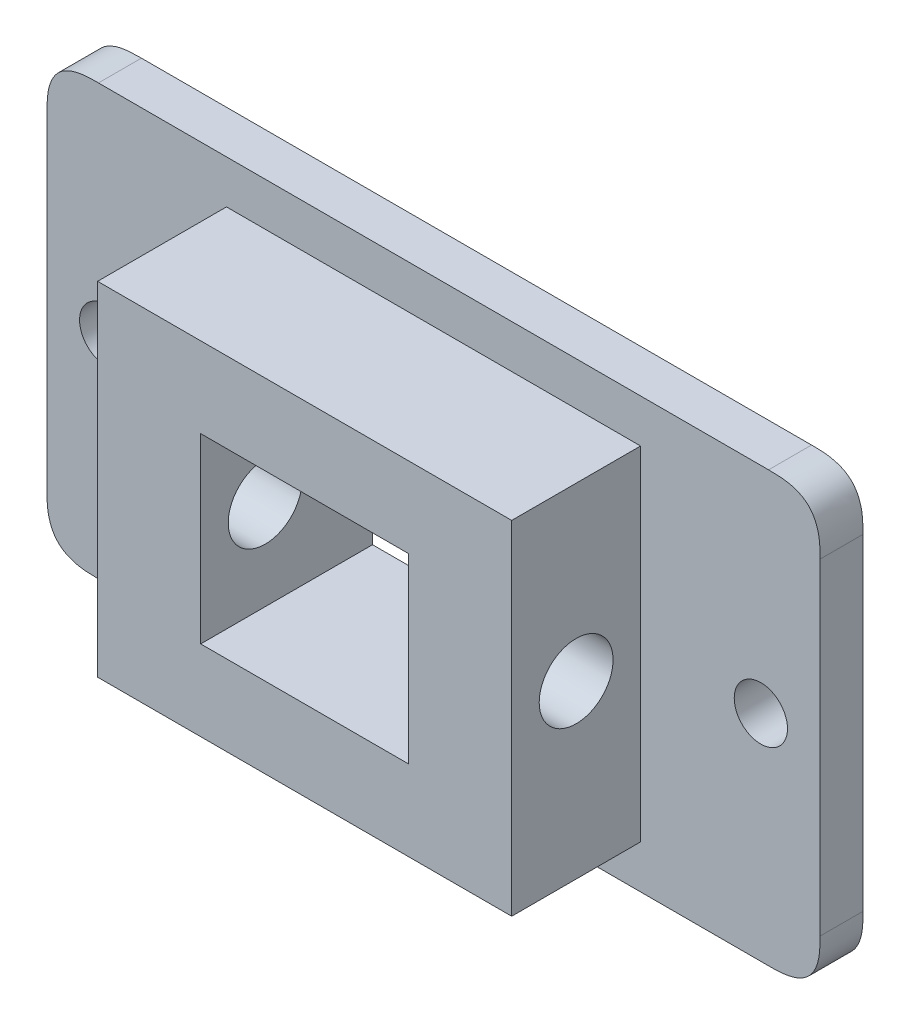
ISO-10303-21;
HEADER;
FILE_DESCRIPTION(('STEP AP214'),'2;1');
FILE_NAME('part.step','',(''),(''),'','','');
FILE_SCHEMA(('AUTOMOTIVE_DESIGN { 1 0 10303 214 1 1 1 1 }'));
ENDSEC;
DATA;
#1=APPLICATION_CONTEXT('core data for automotive mechanical design processes');
#2=APPLICATION_PROTOCOL_DEFINITION('international standard','automotive_design',2000,#1);
#3=PRODUCT_CONTEXT('',#1,'mechanical');
#4=PRODUCT('Part','Part','',(#3));
#5=PRODUCT_RELATED_PRODUCT_CATEGORY('part','',(#4));
#6=PRODUCT_DEFINITION_FORMATION('','',#4);
#7=PRODUCT_DEFINITION_CONTEXT('part definition',#1,'design');
#8=PRODUCT_DEFINITION('design','',#6,#7);
#9=PRODUCT_DEFINITION_SHAPE('','',#8);
#10=(LENGTH_UNIT() NAMED_UNIT(*) SI_UNIT(.MILLI.,.METRE.));
#11=(NAMED_UNIT(*) PLANE_ANGLE_UNIT() SI_UNIT($,.RADIAN.));
#12=(NAMED_UNIT(*) SI_UNIT($,.STERADIAN.) SOLID_ANGLE_UNIT());
#13=UNCERTAINTY_MEASURE_WITH_UNIT(LENGTH_MEASURE(1.E-05),#10,'distance_accuracy_value','');
#14=(GEOMETRIC_REPRESENTATION_CONTEXT(3) GLOBAL_UNCERTAINTY_ASSIGNED_CONTEXT((#13)) GLOBAL_UNIT_ASSIGNED_CONTEXT((#10,
#11,#12)) REPRESENTATION_CONTEXT('',''));
#15=CARTESIAN_POINT('',(0.,0.,0.));
#16=DIRECTION('',(0.,0.,1.));
#17=DIRECTION('',(1.,0.,0.));
#18=AXIS2_PLACEMENT_3D('',#15,#16,#17);
#19=CARTESIAN_POINT('',(-22.5,12.5,2.5));
#20=DIRECTION('',(0.,-1.,0.));
#21=DIRECTION('',(0.,0.,-1.));
#22=AXIS2_PLACEMENT_3D('',#19,#20,#21);
#23=PLANE('',#22);
#24=DIRECTION('',(-1.,0.,0.));
#25=VECTOR('',#24,1.);
#26=CARTESIAN_POINT('',(-22.5,12.5,2.5));
#27=LINE('',#26,#25);
#28=CARTESIAN_POINT('',(19.5,12.5,2.5));
#29=VERTEX_POINT('',#28);
#30=CARTESIAN_POINT('',(-19.5,12.5,2.5));
#31=VERTEX_POINT('',#30);
#32=EDGE_CURVE('E65',#29,#31,#27,.T.);
#33=ORIENTED_EDGE('',*,*,#32,.F.);
#34=CARTESIAN_POINT('',(19.5,12.5,-0.125));
#35=CARTESIAN_POINT('',(19.5,12.5,0.791666666666667));
#36=CARTESIAN_POINT('',(19.5,12.5,1.70833333333321));
#37=CARTESIAN_POINT('',(19.5,12.5,2.625));
#38=B_SPLINE_CURVE_WITH_KNOTS('',3,(#34,#35,#36,#37),.UNSPECIFIED.,.F.,.F.,(4,4),(-0.000125,
0.002625),.UNSPECIFIED.);
#39=CARTESIAN_POINT('',(19.5,12.5,0.));
#40=VERTEX_POINT('',#39);
#41=EDGE_CURVE('E59',#29,#40,#38,.F.);
#42=ORIENTED_EDGE('',*,*,#41,.T.);
#43=DIRECTION('',(-1.,0.,0.));
#44=VECTOR('',#43,1.);
#45=CARTESIAN_POINT('',(-22.5,12.5,0.));
#46=LINE('',#45,#44);
#47=CARTESIAN_POINT('',(-19.5,12.5,0.));
#48=VERTEX_POINT('',#47);
#49=EDGE_CURVE('E656',#40,#48,#46,.T.);
#50=ORIENTED_EDGE('',*,*,#49,.T.);
#51=CARTESIAN_POINT('',(-19.5,12.5,2.625));
#52=CARTESIAN_POINT('',(-19.5,12.5,1.70833333333321));
#53=CARTESIAN_POINT('',(-19.5,12.5,0.791666666666667));
#54=CARTESIAN_POINT('',(-19.5,12.5,-0.125));
#55=B_SPLINE_CURVE_WITH_KNOTS('',3,(#51,#52,#53,#54),.UNSPECIFIED.,.F.,.F.,(4,4),(-0.000125,
0.002625),.UNSPECIFIED.);
#56=EDGE_CURVE('E12',#48,#31,#55,.F.);
#57=ORIENTED_EDGE('',*,*,#56,.T.);
#58=EDGE_LOOP('',(#33,#42,#50,#57));
#59=FACE_BOUND('',#58,.T.);
#60=ADVANCED_FACE('F45',(#59),#23,.F.);
#61=CARTESIAN_POINT('',(-22.5,-12.5,2.5));
#62=DIRECTION('',(0.,1.,0.));
#63=DIRECTION('',(0.,0.,1.));
#64=AXIS2_PLACEMENT_3D('',#61,#62,#63);
#65=PLANE('',#64);
#66=DIRECTION('',(1.,0.,0.));
#67=VECTOR('',#66,1.);
#68=CARTESIAN_POINT('',(-22.5,-12.5,2.5));
#69=LINE('',#68,#67);
#70=CARTESIAN_POINT('',(-19.5,-12.5,2.5));
#71=VERTEX_POINT('',#70);
#72=CARTESIAN_POINT('',(19.5,-12.5,2.5));
#73=VERTEX_POINT('',#72);
#74=EDGE_CURVE('E636',#71,#73,#69,.T.);
#75=ORIENTED_EDGE('',*,*,#74,.F.);
#76=CARTESIAN_POINT('',(-19.5,-12.5,-0.125));
#77=CARTESIAN_POINT('',(-19.5,-12.5,0.791666666666667));
#78=CARTESIAN_POINT('',(-19.5,-12.5,1.70833333333321));
#79=CARTESIAN_POINT('',(-19.5,-12.5,2.625));
#80=B_SPLINE_CURVE_WITH_KNOTS('',3,(#76,#77,#78,#79),.UNSPECIFIED.,.F.,.F.,(4,4),(-0.000125,
0.002625),.UNSPECIFIED.);
#81=CARTESIAN_POINT('',(-19.5,-12.5,0.));
#82=VERTEX_POINT('',#81);
#83=EDGE_CURVE('E438',#71,#82,#80,.F.);
#84=ORIENTED_EDGE('',*,*,#83,.T.);
#85=DIRECTION('',(1.,0.,0.));
#86=VECTOR('',#85,1.);
#87=CARTESIAN_POINT('',(-22.5,-12.5,0.));
#88=LINE('',#87,#86);
#89=CARTESIAN_POINT('',(19.5,-12.5,0.));
#90=VERTEX_POINT('',#89);
#91=EDGE_CURVE('E320',#82,#90,#88,.T.);
#92=ORIENTED_EDGE('',*,*,#91,.T.);
#93=CARTESIAN_POINT('',(19.5,-12.5,2.625));
#94=CARTESIAN_POINT('',(19.5,-12.5,1.70833333333321));
#95=CARTESIAN_POINT('',(19.5,-12.5,0.791666666666667));
#96=CARTESIAN_POINT('',(19.5,-12.5,-0.125));
#97=B_SPLINE_CURVE_WITH_KNOTS('',3,(#93,#94,#95,#96),.UNSPECIFIED.,.F.,.F.,(4,4),(-0.000125,
0.002625),.UNSPECIFIED.);
#98=EDGE_CURVE('E517',#90,#73,#97,.F.);
#99=ORIENTED_EDGE('',*,*,#98,.T.);
#100=EDGE_LOOP('',(#75,#84,#92,#99));
#101=FACE_BOUND('',#100,.T.);
#102=ADVANCED_FACE('F707',(#101),#65,.F.);
#103=CARTESIAN_POINT('',(0.,0.,10.));
#104=DIRECTION('',(0.,0.,1.));
#105=DIRECTION('',(1.,0.,0.));
#106=AXIS2_PLACEMENT_3D('',#103,#104,#105);
#107=PLANE('',#106);
#108=DIRECTION('',(-1.,0.,0.));
#109=VECTOR('',#108,1.);
#110=CARTESIAN_POINT('',(-6.05,-5.3,10.));
#111=LINE('',#110,#109);
#112=CARTESIAN_POINT('',(6.05,-5.3,10.));
#113=VERTEX_POINT('',#112);
#114=CARTESIAN_POINT('',(-6.05,-5.3,10.));
#115=VERTEX_POINT('',#114);
#116=EDGE_CURVE('E278',#113,#115,#111,.T.);
#117=ORIENTED_EDGE('',*,*,#116,.T.);
#118=DIRECTION('',(0.,-1.,0.));
#119=VECTOR('',#118,1.);
#120=CARTESIAN_POINT('',(-6.05,-5.3,10.));
#121=LINE('',#120,#119);
#122=CARTESIAN_POINT('',(-6.04999999999999,5.3,10.));
#123=VERTEX_POINT('',#122);
#124=EDGE_CURVE('E252',#123,#115,#121,.T.);
#125=ORIENTED_EDGE('',*,*,#124,.F.);
#126=DIRECTION('',(1.,0.,0.));
#127=VECTOR('',#126,1.);
#128=CARTESIAN_POINT('',(6.05,5.3,10.));
#129=LINE('',#128,#127);
#130=CARTESIAN_POINT('',(6.05,5.3,10.));
#131=VERTEX_POINT('',#130);
#132=EDGE_CURVE('E271',#123,#131,#129,.T.);
#133=ORIENTED_EDGE('',*,*,#132,.T.);
#134=DIRECTION('',(0.,-1.,0.));
#135=VECTOR('',#134,1.);
#136=CARTESIAN_POINT('',(6.05,-5.3,10.));
#137=LINE('',#136,#135);
#138=EDGE_CURVE('E261',#131,#113,#137,.T.);
#139=ORIENTED_EDGE('',*,*,#138,.T.);
#140=EDGE_LOOP('',(#117,#125,#133,#139));
#141=FACE_BOUND('',#140,.T.);
#142=DIRECTION('',(0.,-1.,0.));
#143=VECTOR('',#142,1.);
#144=CARTESIAN_POINT('',(12.05,-5.3,10.));
#145=LINE('',#144,#143);
#146=CARTESIAN_POINT('',(12.05,9.97690783901171,10.));
#147=VERTEX_POINT('',#146);
#148=CARTESIAN_POINT('',(12.05,-9.97690783901171,10.));
#149=VERTEX_POINT('',#148);
#150=EDGE_CURVE('E216',#147,#149,#145,.T.);
#151=ORIENTED_EDGE('',*,*,#150,.F.);
#152=DIRECTION('',(-1.,0.,0.));
#153=VECTOR('',#152,1.);
#154=CARTESIAN_POINT('',(-12.05,9.97690783901171,10.));
#155=LINE('',#154,#153);
#156=CARTESIAN_POINT('',(-12.05,9.97690783901171,10.));
#157=VERTEX_POINT('',#156);
#158=EDGE_CURVE('E192',#147,#157,#155,.T.);
#159=ORIENTED_EDGE('',*,*,#158,.T.);
#160=DIRECTION('',(0.,-1.,0.));
#161=VECTOR('',#160,1.);
#162=CARTESIAN_POINT('',(-12.05,9.97690783901171,10.));
#163=LINE('',#162,#161);
#164=CARTESIAN_POINT('',(-12.05,-9.97690783901171,10.));
#165=VERTEX_POINT('',#164);
#166=EDGE_CURVE('E203',#157,#165,#163,.T.);
#167=ORIENTED_EDGE('',*,*,#166,.T.);
#168=DIRECTION('',(1.,0.,0.));
#169=VECTOR('',#168,1.);
#170=CARTESIAN_POINT('',(-12.05,-9.97690783901171,10.));
#171=LINE('',#170,#169);
#172=EDGE_CURVE('E211',#165,#149,#171,.T.);
#173=ORIENTED_EDGE('',*,*,#172,.T.);
#174=EDGE_LOOP('',(#151,#159,#167,#173));
#175=FACE_BOUND('',#174,.T.);
#176=ADVANCED_FACE('F214',(#141,#175),#107,.T.);
#177=CARTESIAN_POINT('',(12.05,0.,0.));
#178=DIRECTION('',(1.,0.,0.));
#179=DIRECTION('',(0.,0.,-1.));
#180=AXIS2_PLACEMENT_3D('',#177,#178,#179);
#181=PLANE('',#180);
#182=CARTESIAN_POINT('',(12.05,0.,6.25));
#183=DIRECTION('',(-1.,0.,0.));
#184=DIRECTION('',(0.,0.,1.));
#185=AXIS2_PLACEMENT_3D('',#182,#183,#184);
#186=CIRCLE('',#185,2.15);
#187=CARTESIAN_POINT('',(12.05,0.,8.4));
#188=VERTEX_POINT('',#187);
#189=EDGE_CURVE('E257',#188,#188,#186,.T.);
#190=ORIENTED_EDGE('',*,*,#189,.T.);
#191=EDGE_LOOP('',(#190));
#192=FACE_BOUND('',#191,.T.);
#193=DIRECTION('',(0.,1.,0.));
#194=VECTOR('',#193,1.);
#195=CARTESIAN_POINT('',(12.05,-5.3,2.5));
#196=LINE('',#195,#194);
#197=CARTESIAN_POINT('',(12.05,-9.97690783901171,2.5));
#198=VERTEX_POINT('',#197);
#199=CARTESIAN_POINT('',(12.05,9.97690783901171,2.49999999999999));
#200=VERTEX_POINT('',#199);
#201=EDGE_CURVE('E265',#198,#200,#196,.T.);
#202=ORIENTED_EDGE('',*,*,#201,.T.);
#203=DIRECTION('',(0.,0.,1.));
#204=VECTOR('',#203,1.);
#205=CARTESIAN_POINT('',(12.05,9.97690783901171,-49.6302868014363));
#206=LINE('',#205,#204);
#207=EDGE_CURVE('E200',#200,#147,#206,.T.);
#208=ORIENTED_EDGE('',*,*,#207,.T.);
#209=ORIENTED_EDGE('',*,*,#150,.T.);
#210=DIRECTION('',(0.,0.,1.));
#211=VECTOR('',#210,1.);
#212=CARTESIAN_POINT('',(12.05,-9.97690783901171,-49.6302868014363));
#213=LINE('',#212,#211);
#214=EDGE_CURVE('E227',#198,#149,#213,.T.);
#215=ORIENTED_EDGE('',*,*,#214,.F.);
#216=EDGE_LOOP('',(#202,#208,#209,#215));
#217=FACE_BOUND('',#216,.T.);
#218=ADVANCED_FACE('F762',(#192,#217),#181,.T.);
#219=CARTESIAN_POINT('',(-14.05,0.,6.25));
#220=DIRECTION('',(1.,0.,0.));
#221=DIRECTION('',(0.,0.,-1.));
#222=AXIS2_PLACEMENT_3D('',#219,#220,#221);
#223=CYLINDRICAL_SURFACE('',#222,2.15);
#224=CARTESIAN_POINT('',(-6.05,0.,6.25));
#225=DIRECTION('',(1.,0.,0.));
#226=DIRECTION('',(0.,0.,-1.));
#227=AXIS2_PLACEMENT_3D('',#224,#225,#226);
#228=CIRCLE('',#227,2.15);
#229=CARTESIAN_POINT('',(-6.05,0.,4.1));
#230=VERTEX_POINT('',#229);
#231=EDGE_CURVE('E248',#230,#230,#228,.T.);
#232=ORIENTED_EDGE('',*,*,#231,.T.);
#233=EDGE_LOOP('',(#232));
#234=FACE_BOUND('',#233,.T.);
#235=CARTESIAN_POINT('',(-12.05,0.,6.25));
#236=DIRECTION('',(-1.,0.,0.));
#237=DIRECTION('',(0.,0.,1.));
#238=AXIS2_PLACEMENT_3D('',#235,#236,#237);
#239=CIRCLE('',#238,2.15);
#240=CARTESIAN_POINT('',(-12.05,0.,8.4));
#241=VERTEX_POINT('',#240);
#242=EDGE_CURVE('E53',#241,#241,#239,.F.);
#243=ORIENTED_EDGE('',*,*,#242,.F.);
#244=EDGE_LOOP('',(#243));
#245=FACE_BOUND('',#244,.T.);
#246=ADVANCED_FACE('F380',(#234,#245),#223,.F.);
#247=CARTESIAN_POINT('',(0.,0.,2.5));
#248=DIRECTION('',(0.,0.,1.));
#249=DIRECTION('',(1.,0.,0.));
#250=AXIS2_PLACEMENT_3D('',#247,#248,#249);
#251=PLANE('',#250);
#252=DIRECTION('',(1.,0.,0.));
#253=VECTOR('',#252,1.);
#254=CARTESIAN_POINT('',(-12.05,9.97690783901171,2.5));
#255=LINE('',#254,#253);
#256=CARTESIAN_POINT('',(-12.05,9.97690783901171,2.5));
#257=VERTEX_POINT('',#256);
#258=EDGE_CURVE('E195',#257,#200,#255,.T.);
#259=ORIENTED_EDGE('',*,*,#258,.T.);
#260=ORIENTED_EDGE('',*,*,#201,.F.);
#261=DIRECTION('',(-1.,0.,0.));
#262=VECTOR('',#261,1.);
#263=CARTESIAN_POINT('',(-12.05,-9.97690783901171,2.5));
#264=LINE('',#263,#262);
#265=CARTESIAN_POINT('',(-12.05,-9.97690783901171,2.5));
#266=VERTEX_POINT('',#265);
#267=EDGE_CURVE('E222',#198,#266,#264,.T.);
#268=ORIENTED_EDGE('',*,*,#267,.T.);
#269=DIRECTION('',(0.,1.,0.));
#270=VECTOR('',#269,1.);
#271=CARTESIAN_POINT('',(-12.05,9.97690783901171,2.5));
#272=LINE('',#271,#270);
#273=EDGE_CURVE('E801',#266,#257,#272,.T.);
#274=ORIENTED_EDGE('',*,*,#273,.T.);
#275=EDGE_LOOP('',(#259,#260,#268,#274));
#276=FACE_BOUND('',#275,.T.);
#277=CARTESIAN_POINT('',(19.05,0.,2.5));
#278=DIRECTION('',(0.,0.,1.));
#279=DIRECTION('',(1.,0.,0.));
#280=AXIS2_PLACEMENT_3D('',#277,#278,#279);
#281=CIRCLE('',#280,1.55);
#282=CARTESIAN_POINT('',(20.6,0.,2.5));
#283=VERTEX_POINT('',#282);
#284=EDGE_CURVE('E245',#283,#283,#281,.T.);
#285=ORIENTED_EDGE('',*,*,#284,.F.);
#286=EDGE_LOOP('',(#285));
#287=FACE_BOUND('',#286,.T.);
#288=ORIENTED_EDGE('',*,*,#74,.T.);
#289=CARTESIAN_POINT('',(22.5,-9.5,2.5));
#290=CARTESIAN_POINT('',(22.5,-10.0045941546018,2.5));
#291=CARTESIAN_POINT('',(22.5,-10.5091883092037,2.5));
#292=CARTESIAN_POINT('',(22.2849242404918,-11.6213203435596,2.5));
#293=CARTESIAN_POINT('',(21.6213203435596,-12.2849242404917,2.5));
#294=CARTESIAN_POINT('',(20.5091883092037,-12.5,2.5));
#295=CARTESIAN_POINT('',(20.0045941546018,-12.5,2.5));
#296=CARTESIAN_POINT('',(19.5,-12.5,2.5));
#297=B_SPLINE_CURVE_WITH_KNOTS('',5,(#289,#290,#291,#292,#293,#294,#295,#296),.UNSPECIFIED.,.F.,
.F.,(6,2,6),(0.,0.5,1.),.UNSPECIFIED.);
#298=CARTESIAN_POINT('',(22.5,-9.5,2.5));
#299=VERTEX_POINT('',#298);
#300=EDGE_CURVE('E997',#73,#299,#297,.F.);
#301=ORIENTED_EDGE('',*,*,#300,.T.);
#302=DIRECTION('',(0.,1.,0.));
#303=VECTOR('',#302,1.);
#304=CARTESIAN_POINT('',(22.5,12.5,2.5));
#305=LINE('',#304,#303);
#306=CARTESIAN_POINT('',(22.5,9.5,2.5));
#307=VERTEX_POINT('',#306);
#308=EDGE_CURVE('E318',#299,#307,#305,.T.);
#309=ORIENTED_EDGE('',*,*,#308,.T.);
#310=CARTESIAN_POINT('',(19.5,12.5,2.5));
#311=CARTESIAN_POINT('',(20.0045941546018,12.5,2.5));
#312=CARTESIAN_POINT('',(20.5091883092037,12.5,2.5));
#313=CARTESIAN_POINT('',(21.6213203435596,12.2849242404917,2.5));
#314=CARTESIAN_POINT('',(22.2849242404917,11.6213203435596,2.5));
#315=CARTESIAN_POINT('',(22.5,10.5091883092037,2.5));
#316=CARTESIAN_POINT('',(22.5,10.0045941546018,2.5));
#317=CARTESIAN_POINT('',(22.5,9.5,2.5));
#318=B_SPLINE_CURVE_WITH_KNOTS('',5,(#310,#311,#312,#313,#314,#315,#316,#317),.UNSPECIFIED.,.F.,
.F.,(6,2,6),(0.,0.5,1.),.UNSPECIFIED.);
#319=EDGE_CURVE('E364',#307,#29,#318,.F.);
#320=ORIENTED_EDGE('',*,*,#319,.T.);
#321=ORIENTED_EDGE('',*,*,#32,.T.);
#322=CARTESIAN_POINT('',(-22.5,9.5,2.5));
#323=CARTESIAN_POINT('',(-22.5,10.0045941546018,2.5));
#324=CARTESIAN_POINT('',(-22.5,10.5091883092037,2.5));
#325=CARTESIAN_POINT('',(-22.2849242404917,11.6213203435596,2.5));
#326=CARTESIAN_POINT('',(-21.6213203435596,12.2849242404917,2.5));
#327=CARTESIAN_POINT('',(-20.5091883092037,12.5,2.5));
#328=CARTESIAN_POINT('',(-20.0045941546018,12.5,2.5));
#329=CARTESIAN_POINT('',(-19.5,12.5,2.5));
#330=B_SPLINE_CURVE_WITH_KNOTS('',5,(#322,#323,#324,#325,#326,#327,#328,#329),.UNSPECIFIED.,.F.,
.F.,(6,2,6),(0.,0.5,1.),.UNSPECIFIED.);
#331=CARTESIAN_POINT('',(-22.5,9.5,2.5));
#332=VERTEX_POINT('',#331);
#333=EDGE_CURVE('E551',#31,#332,#330,.F.);
#334=ORIENTED_EDGE('',*,*,#333,.T.);
#335=DIRECTION('',(0.,-1.,0.));
#336=VECTOR('',#335,1.);
#337=CARTESIAN_POINT('',(-22.5,12.5,2.5));
#338=LINE('',#337,#336);
#339=CARTESIAN_POINT('',(-22.5,-9.5,2.5));
#340=VERTEX_POINT('',#339);
#341=EDGE_CURVE('E638',#332,#340,#338,.T.);
#342=ORIENTED_EDGE('',*,*,#341,.T.);
#343=CARTESIAN_POINT('',(-19.5,-12.5,2.5));
#344=CARTESIAN_POINT('',(-20.0045941546018,-12.5,2.5));
#345=CARTESIAN_POINT('',(-20.5091883092037,-12.5,2.5));
#346=CARTESIAN_POINT('',(-21.6213203435596,-12.2849242404917,2.5));
#347=CARTESIAN_POINT('',(-22.2849242404917,-11.6213203435596,2.5));
#348=CARTESIAN_POINT('',(-22.5,-10.5091883092037,2.5));
#349=CARTESIAN_POINT('',(-22.5,-10.0045941546018,2.5));
#350=CARTESIAN_POINT('',(-22.5,-9.5,2.5));
#351=B_SPLINE_CURVE_WITH_KNOTS('',5,(#343,#344,#345,#346,#347,#348,#349,#350),.UNSPECIFIED.,.F.,
.F.,(6,2,6),(0.,0.5,1.),.UNSPECIFIED.);
#352=EDGE_CURVE('E449',#340,#71,#351,.F.);
#353=ORIENTED_EDGE('',*,*,#352,.T.);
#354=EDGE_LOOP('',(#288,#301,#309,#320,#321,#334,#342,#353));
#355=FACE_BOUND('',#354,.T.);
#356=CARTESIAN_POINT('',(-19.05,0.,2.5));
#357=DIRECTION('',(0.,0.,1.));
#358=DIRECTION('',(1.,0.,0.));
#359=AXIS2_PLACEMENT_3D('',#356,#357,#358);
#360=CIRCLE('',#359,1.55);
#361=CARTESIAN_POINT('',(-17.5,0.,2.5));
#362=VERTEX_POINT('',#361);
#363=EDGE_CURVE('E238',#362,#362,#360,.T.);
#364=ORIENTED_EDGE('',*,*,#363,.F.);
#365=EDGE_LOOP('',(#364));
#366=FACE_BOUND('',#365,.T.);
#367=ADVANCED_FACE('F370',(#276,#287,#355,#366),#251,.T.);
#368=CARTESIAN_POINT('',(0.,0.,0.));
#369=DIRECTION('',(0.,0.,1.));
#370=DIRECTION('',(1.,0.,0.));
#371=AXIS2_PLACEMENT_3D('',#368,#369,#370);
#372=PLANE('',#371);
#373=CARTESIAN_POINT('',(19.05,0.,0.));
#374=DIRECTION('',(0.,0.,-1.));
#375=DIRECTION('',(-1.,0.,0.));
#376=AXIS2_PLACEMENT_3D('',#373,#374,#375);
#377=CIRCLE('',#376,1.55);
#378=CARTESIAN_POINT('',(17.5,0.,0.));
#379=VERTEX_POINT('',#378);
#380=EDGE_CURVE('E235',#379,#379,#377,.T.);
#381=ORIENTED_EDGE('',*,*,#380,.F.);
#382=EDGE_LOOP('',(#381));
#383=FACE_BOUND('',#382,.T.);
#384=CARTESIAN_POINT('',(-19.05,0.,0.));
#385=DIRECTION('',(0.,0.,-1.));
#386=DIRECTION('',(1.,0.,0.));
#387=AXIS2_PLACEMENT_3D('',#384,#385,#386);
#388=CIRCLE('',#387,1.55);
#389=CARTESIAN_POINT('',(-17.5,0.,0.));
#390=VERTEX_POINT('',#389);
#391=EDGE_CURVE('E239',#390,#390,#388,.T.);
#392=ORIENTED_EDGE('',*,*,#391,.F.);
#393=EDGE_LOOP('',(#392));
#394=FACE_BOUND('',#393,.T.);
#395=ORIENTED_EDGE('',*,*,#91,.F.);
#396=CARTESIAN_POINT('',(-22.5,-9.5,0.));
#397=CARTESIAN_POINT('',(-22.5,-10.0045941546018,0.));
#398=CARTESIAN_POINT('',(-22.5,-10.5091883092037,0.));
#399=CARTESIAN_POINT('',(-22.2849242404917,-11.6213203435596,0.));
#400=CARTESIAN_POINT('',(-21.6213203435596,-12.2849242404917,0.));
#401=CARTESIAN_POINT('',(-20.5091883092037,-12.5,0.));
#402=CARTESIAN_POINT('',(-20.0045941546018,-12.5,0.));
#403=CARTESIAN_POINT('',(-19.5,-12.5,0.));
#404=B_SPLINE_CURVE_WITH_KNOTS('',5,(#396,#397,#398,#399,#400,#401,#402,#403),.UNSPECIFIED.,.F.,
.F.,(6,2,6),(0.,0.5,1.),.UNSPECIFIED.);
#405=CARTESIAN_POINT('',(-22.5,-9.5,0.));
#406=VERTEX_POINT('',#405);
#407=EDGE_CURVE('E426',#82,#406,#404,.F.);
#408=ORIENTED_EDGE('',*,*,#407,.T.);
#409=DIRECTION('',(0.,-1.,0.));
#410=VECTOR('',#409,1.);
#411=CARTESIAN_POINT('',(-22.5,12.5,0.));
#412=LINE('',#411,#410);
#413=CARTESIAN_POINT('',(-22.5,9.5,0.));
#414=VERTEX_POINT('',#413);
#415=EDGE_CURVE('E659',#414,#406,#412,.T.);
#416=ORIENTED_EDGE('',*,*,#415,.F.);
#417=CARTESIAN_POINT('',(-19.5,12.5,0.));
#418=CARTESIAN_POINT('',(-20.0045941546018,12.5,0.));
#419=CARTESIAN_POINT('',(-20.5091883092037,12.5,0.));
#420=CARTESIAN_POINT('',(-21.6213203435596,12.2849242404917,0.));
#421=CARTESIAN_POINT('',(-22.2849242404917,11.6213203435596,0.));
#422=CARTESIAN_POINT('',(-22.5,10.5091883092037,0.));
#423=CARTESIAN_POINT('',(-22.5,10.0045941546018,0.));
#424=CARTESIAN_POINT('',(-22.5,9.5,0.));
#425=B_SPLINE_CURVE_WITH_KNOTS('',5,(#417,#418,#419,#420,#421,#422,#423,#424),.UNSPECIFIED.,.F.,
.F.,(6,2,6),(0.,0.5,1.),.UNSPECIFIED.);
#426=EDGE_CURVE('E529',#414,#48,#425,.F.);
#427=ORIENTED_EDGE('',*,*,#426,.T.);
#428=ORIENTED_EDGE('',*,*,#49,.F.);
#429=CARTESIAN_POINT('',(22.5,9.5,0.));
#430=CARTESIAN_POINT('',(22.5,10.0045941546018,0.));
#431=CARTESIAN_POINT('',(22.5,10.5091883092037,0.));
#432=CARTESIAN_POINT('',(22.2849242404917,11.6213203435596,0.));
#433=CARTESIAN_POINT('',(21.6213203435596,12.2849242404917,0.));
#434=CARTESIAN_POINT('',(20.5091883092037,12.5,0.));
#435=CARTESIAN_POINT('',(20.0045941546018,12.5,0.));
#436=CARTESIAN_POINT('',(19.5,12.5,0.));
#437=B_SPLINE_CURVE_WITH_KNOTS('',5,(#429,#430,#431,#432,#433,#434,#435,#436),.UNSPECIFIED.,.F.,
.F.,(6,2,6),(0.,0.5,1.),.UNSPECIFIED.);
#438=CARTESIAN_POINT('',(22.5,9.5,0.));
#439=VERTEX_POINT('',#438);
#440=EDGE_CURVE('E571',#40,#439,#437,.F.);
#441=ORIENTED_EDGE('',*,*,#440,.T.);
#442=DIRECTION('',(0.,1.,0.));
#443=VECTOR('',#442,1.);
#444=CARTESIAN_POINT('',(22.5,12.5,0.));
#445=LINE('',#444,#443);
#446=CARTESIAN_POINT('',(22.5,-9.5,0.));
#447=VERTEX_POINT('',#446);
#448=EDGE_CURVE('E312',#447,#439,#445,.T.);
#449=ORIENTED_EDGE('',*,*,#448,.F.);
#450=CARTESIAN_POINT('',(19.5,-12.5,0.));
#451=CARTESIAN_POINT('',(20.0045941546018,-12.5,0.));
#452=CARTESIAN_POINT('',(20.5091883092037,-12.5,0.));
#453=CARTESIAN_POINT('',(21.6213203435596,-12.2849242404917,0.));
#454=CARTESIAN_POINT('',(22.2849242404918,-11.6213203435596,0.));
#455=CARTESIAN_POINT('',(22.5,-10.5091883092037,0.));
#456=CARTESIAN_POINT('',(22.5,-10.0045941546018,0.));
#457=CARTESIAN_POINT('',(22.5,-9.5,0.));
#458=B_SPLINE_CURVE_WITH_KNOTS('',5,(#450,#451,#452,#453,#454,#455,#456,#457),.UNSPECIFIED.,.F.,
.F.,(6,2,6),(0.,0.5,1.),.UNSPECIFIED.);
#459=EDGE_CURVE('E472',#447,#90,#458,.F.);
#460=ORIENTED_EDGE('',*,*,#459,.T.);
#461=EDGE_LOOP('',(#395,#408,#416,#427,#428,#441,#449,#460));
#462=FACE_BOUND('',#461,.T.);
#463=DIRECTION('',(0.,1.,0.));
#464=VECTOR('',#463,1.);
#465=CARTESIAN_POINT('',(6.05,5.3,0.));
#466=LINE('',#465,#464);
#467=CARTESIAN_POINT('',(6.05,-5.3,0.));
#468=VERTEX_POINT('',#467);
#469=CARTESIAN_POINT('',(6.05,5.3,0.));
#470=VERTEX_POINT('',#469);
#471=EDGE_CURVE('E282',#468,#470,#466,.T.);
#472=ORIENTED_EDGE('',*,*,#471,.T.);
#473=DIRECTION('',(-1.,0.,0.));
#474=VECTOR('',#473,1.);
#475=CARTESIAN_POINT('',(-6.05,5.3,0.));
#476=LINE('',#475,#474);
#477=CARTESIAN_POINT('',(-6.05,5.3,0.));
#478=VERTEX_POINT('',#477);
#479=EDGE_CURVE('E286',#470,#478,#476,.T.);
#480=ORIENTED_EDGE('',*,*,#479,.T.);
#481=DIRECTION('',(0.,-1.,0.));
#482=VECTOR('',#481,1.);
#483=CARTESIAN_POINT('',(-6.05,5.3,0.));
#484=LINE('',#483,#482);
#485=CARTESIAN_POINT('',(-6.05,-5.3,0.));
#486=VERTEX_POINT('',#485);
#487=EDGE_CURVE('E290',#478,#486,#484,.T.);
#488=ORIENTED_EDGE('',*,*,#487,.T.);
#489=DIRECTION('',(1.,0.,0.));
#490=VECTOR('',#489,1.);
#491=CARTESIAN_POINT('',(-6.05,-5.3,0.));
#492=LINE('',#491,#490);
#493=EDGE_CURVE('E294',#486,#468,#492,.T.);
#494=ORIENTED_EDGE('',*,*,#493,.T.);
#495=EDGE_LOOP('',(#472,#480,#488,#494));
#496=FACE_BOUND('',#495,.T.);
#497=ADVANCED_FACE('F343',(#383,#394,#462,#496),#372,.F.);
#498=CARTESIAN_POINT('',(22.5,12.5,2.5));
#499=DIRECTION('',(-1.,0.,0.));
#500=DIRECTION('',(0.,-1.,0.));
#501=AXIS2_PLACEMENT_3D('',#498,#499,#500);
#502=PLANE('',#501);
#503=ORIENTED_EDGE('',*,*,#308,.F.);
#504=CARTESIAN_POINT('',(22.5,-9.5,-0.125));
#505=CARTESIAN_POINT('',(22.5,-9.5,0.791666666666667));
#506=CARTESIAN_POINT('',(22.5,-9.5,1.70833333333321));
#507=CARTESIAN_POINT('',(22.5,-9.5,2.625));
#508=B_SPLINE_CURVE_WITH_KNOTS('',3,(#504,#505,#506,#507),.UNSPECIFIED.,.F.,.F.,(4,4),
(-0.000125,0.002625),.UNSPECIFIED.);
#509=EDGE_CURVE('E605',#299,#447,#508,.F.);
#510=ORIENTED_EDGE('',*,*,#509,.T.);
#511=ORIENTED_EDGE('',*,*,#448,.T.);
#512=CARTESIAN_POINT('',(22.5,9.5,2.625));
#513=CARTESIAN_POINT('',(22.5,9.5,1.70833333333321));
#514=CARTESIAN_POINT('',(22.5,9.5,0.791666666666667));
#515=CARTESIAN_POINT('',(22.5,9.5,-0.125));
#516=B_SPLINE_CURVE_WITH_KNOTS('',3,(#512,#513,#514,#515),.UNSPECIFIED.,.F.,.F.,(4,4),
(-0.000125,0.002625),.UNSPECIFIED.);
#517=EDGE_CURVE('E73',#439,#307,#516,.F.);
#518=ORIENTED_EDGE('',*,*,#517,.T.);
#519=EDGE_LOOP('',(#503,#510,#511,#518));
#520=FACE_BOUND('',#519,.T.);
#521=ADVANCED_FACE('F332',(#520),#502,.F.);
#522=CARTESIAN_POINT('',(-22.5,12.5,2.5));
#523=DIRECTION('',(1.,0.,0.));
#524=DIRECTION('',(0.,0.,-1.));
#525=AXIS2_PLACEMENT_3D('',#522,#523,#524);
#526=PLANE('',#525);
#527=ORIENTED_EDGE('',*,*,#415,.T.);
#528=CARTESIAN_POINT('',(-22.5,-9.5,2.625));
#529=CARTESIAN_POINT('',(-22.5,-9.5,1.70833333333321));
#530=CARTESIAN_POINT('',(-22.5,-9.5,0.791666666666667));
#531=CARTESIAN_POINT('',(-22.5,-9.5,-0.125));
#532=B_SPLINE_CURVE_WITH_KNOTS('',3,(#528,#529,#530,#531),.UNSPECIFIED.,.F.,.F.,(4,4),
(-0.000125,0.002625),.UNSPECIFIED.);
#533=EDGE_CURVE('E459',#406,#340,#532,.F.);
#534=ORIENTED_EDGE('',*,*,#533,.T.);
#535=ORIENTED_EDGE('',*,*,#341,.F.);
#536=CARTESIAN_POINT('',(-22.5,9.5,-0.125));
#537=CARTESIAN_POINT('',(-22.5,9.5,0.791666666666667));
#538=CARTESIAN_POINT('',(-22.5,9.5,1.70833333333321));
#539=CARTESIAN_POINT('',(-22.5,9.5,2.625));
#540=B_SPLINE_CURVE_WITH_KNOTS('',3,(#536,#537,#538,#539),.UNSPECIFIED.,.F.,.F.,(4,4),
(-0.000125,0.002625),.UNSPECIFIED.);
#541=EDGE_CURVE('E541',#332,#414,#540,.F.);
#542=ORIENTED_EDGE('',*,*,#541,.T.);
#543=EDGE_LOOP('',(#527,#534,#535,#542));
#544=FACE_BOUND('',#543,.T.);
#545=ADVANCED_FACE('F342',(#544),#526,.F.);
#546=CARTESIAN_POINT('',(6.05,5.3,2.5));
#547=DIRECTION('',(-1.,0.,0.));
#548=DIRECTION('',(0.,0.,1.));
#549=AXIS2_PLACEMENT_3D('',#546,#547,#548);
#550=PLANE('',#549);
#551=ORIENTED_EDGE('',*,*,#471,.F.);
#552=DIRECTION('',(0.,0.,-1.));
#553=VECTOR('',#552,1.);
#554=CARTESIAN_POINT('',(6.05,-5.3,2.5));
#555=LINE('',#554,#553);
#556=EDGE_CURVE('E298',#113,#468,#555,.T.);
#557=ORIENTED_EDGE('',*,*,#556,.F.);
#558=ORIENTED_EDGE('',*,*,#138,.F.);
#559=DIRECTION('',(0.,0.,-1.));
#560=VECTOR('',#559,1.);
#561=CARTESIAN_POINT('',(6.05,5.3,2.5));
#562=LINE('',#561,#560);
#563=EDGE_CURVE('E308',#131,#470,#562,.T.);
#564=ORIENTED_EDGE('',*,*,#563,.T.);
#565=EDGE_LOOP('',(#551,#557,#558,#564));
#566=FACE_BOUND('',#565,.T.);
#567=CARTESIAN_POINT('',(6.05,0.,6.25));
#568=DIRECTION('',(-1.,0.,0.));
#569=DIRECTION('',(0.,0.,1.));
#570=AXIS2_PLACEMENT_3D('',#567,#568,#569);
#571=CIRCLE('',#570,2.15);
#572=CARTESIAN_POINT('',(6.05,0.,8.4));
#573=VERTEX_POINT('',#572);
#574=EDGE_CURVE('E256',#573,#573,#571,.T.);
#575=ORIENTED_EDGE('',*,*,#574,.F.);
#576=EDGE_LOOP('',(#575));
#577=FACE_BOUND('',#576,.T.);
#578=ADVANCED_FACE('F382',(#566,#577),#550,.T.);
#579=CARTESIAN_POINT('',(-6.05,5.3,2.5));
#580=DIRECTION('',(0.,-1.,0.));
#581=DIRECTION('',(0.,0.,-1.));
#582=AXIS2_PLACEMENT_3D('',#579,#580,#581);
#583=PLANE('',#582);
#584=ORIENTED_EDGE('',*,*,#479,.F.);
#585=ORIENTED_EDGE('',*,*,#563,.F.);
#586=ORIENTED_EDGE('',*,*,#132,.F.);
#587=DIRECTION('',(0.,0.,-1.));
#588=VECTOR('',#587,1.);
#589=CARTESIAN_POINT('',(-6.05,5.3,2.5));
#590=LINE('',#589,#588);
#591=EDGE_CURVE('E305',#123,#478,#590,.T.);
#592=ORIENTED_EDGE('',*,*,#591,.T.);
#593=EDGE_LOOP('',(#584,#585,#586,#592));
#594=FACE_BOUND('',#593,.T.);
#595=ADVANCED_FACE('F748',(#594),#583,.T.);
#596=CARTESIAN_POINT('',(-6.05,5.3,2.5));
#597=DIRECTION('',(1.,0.,0.));
#598=DIRECTION('',(0.,1.,0.));
#599=AXIS2_PLACEMENT_3D('',#596,#597,#598);
#600=PLANE('',#599);
#601=ORIENTED_EDGE('',*,*,#487,.F.);
#602=ORIENTED_EDGE('',*,*,#591,.F.);
#603=ORIENTED_EDGE('',*,*,#124,.T.);
#604=DIRECTION('',(0.,0.,-1.));
#605=VECTOR('',#604,1.);
#606=CARTESIAN_POINT('',(-6.05,-5.3,2.5));
#607=LINE('',#606,#605);
#608=EDGE_CURVE('E302',#115,#486,#607,.T.);
#609=ORIENTED_EDGE('',*,*,#608,.T.);
#610=EDGE_LOOP('',(#601,#602,#603,#609));
#611=FACE_BOUND('',#610,.T.);
#612=ORIENTED_EDGE('',*,*,#231,.F.);
#613=EDGE_LOOP('',(#612));
#614=FACE_BOUND('',#613,.T.);
#615=ADVANCED_FACE('F744',(#611,#614),#600,.T.);
#616=CARTESIAN_POINT('',(-6.05,-5.3,2.5));
#617=DIRECTION('',(0.,1.,0.));
#618=DIRECTION('',(0.,0.,1.));
#619=AXIS2_PLACEMENT_3D('',#616,#617,#618);
#620=PLANE('',#619);
#621=ORIENTED_EDGE('',*,*,#493,.F.);
#622=ORIENTED_EDGE('',*,*,#608,.F.);
#623=ORIENTED_EDGE('',*,*,#116,.F.);
#624=ORIENTED_EDGE('',*,*,#556,.T.);
#625=EDGE_LOOP('',(#621,#622,#623,#624));
#626=FACE_BOUND('',#625,.T.);
#627=ADVANCED_FACE('F739',(#626),#620,.T.);
#628=CARTESIAN_POINT('',(12.05,0.,6.25));
#629=DIRECTION('',(-1.,0.,0.));
#630=DIRECTION('',(0.,0.,1.));
#631=AXIS2_PLACEMENT_3D('',#628,#629,#630);
#632=CYLINDRICAL_SURFACE('',#631,2.15);
#633=ORIENTED_EDGE('',*,*,#189,.F.);
#634=EDGE_LOOP('',(#633));
#635=FACE_BOUND('',#634,.T.);
#636=ORIENTED_EDGE('',*,*,#574,.T.);
#637=EDGE_LOOP('',(#636));
#638=FACE_BOUND('',#637,.T.);
#639=ADVANCED_FACE('F726',(#635,#638),#632,.F.);
#640=CARTESIAN_POINT('',(-19.05,0.,10.));
#641=DIRECTION('',(0.,0.,-1.));
#642=DIRECTION('',(-1.,0.,0.));
#643=AXIS2_PLACEMENT_3D('',#640,#641,#642);
#644=CYLINDRICAL_SURFACE('',#643,1.55);
#645=ORIENTED_EDGE('',*,*,#363,.T.);
#646=EDGE_LOOP('',(#645));
#647=FACE_BOUND('',#646,.T.);
#648=ORIENTED_EDGE('',*,*,#391,.T.);
#649=EDGE_LOOP('',(#648));
#650=FACE_BOUND('',#649,.T.);
#651=ADVANCED_FACE('F722',(#647,#650),#644,.F.);
#652=CARTESIAN_POINT('',(19.05,0.,10.));
#653=DIRECTION('',(0.,0.,-1.));
#654=DIRECTION('',(-1.,0.,0.));
#655=AXIS2_PLACEMENT_3D('',#652,#653,#654);
#656=CYLINDRICAL_SURFACE('',#655,1.55);
#657=ORIENTED_EDGE('',*,*,#284,.T.);
#658=EDGE_LOOP('',(#657));
#659=FACE_BOUND('',#658,.T.);
#660=ORIENTED_EDGE('',*,*,#380,.T.);
#661=EDGE_LOOP('',(#660));
#662=FACE_BOUND('',#661,.T.);
#663=ADVANCED_FACE('F725',(#659,#662),#656,.F.);
#664=CARTESIAN_POINT('',(-19.5,-12.5,2.625));
#665=CARTESIAN_POINT('',(-19.5,-12.5,1.70833333333321));
#666=CARTESIAN_POINT('',(-19.5,-12.5,0.791666666666667));
#667=CARTESIAN_POINT('',(-19.5,-12.5,-0.125));
#668=CARTESIAN_POINT('',(-20.0045941546018,-12.5,2.625));
#669=CARTESIAN_POINT('',(-20.0045941546018,-12.5,1.70833333333321));
#670=CARTESIAN_POINT('',(-20.0045941546018,-12.5,0.791666666666667));
#671=CARTESIAN_POINT('',(-20.0045941546018,-12.5,-0.125));
#672=CARTESIAN_POINT('',(-20.5091883092037,-12.5,2.625));
#673=CARTESIAN_POINT('',(-20.5091883092037,-12.5,1.70833333333321));
#674=CARTESIAN_POINT('',(-20.5091883092037,-12.5,0.791666666666667));
#675=CARTESIAN_POINT('',(-20.5091883092037,-12.5,-0.125));
#676=CARTESIAN_POINT('',(-21.6213203435596,-12.2849242404917,2.625));
#677=CARTESIAN_POINT('',(-21.6213203435596,-12.2849242404917,1.70833333333321));
#678=CARTESIAN_POINT('',(-21.6213203435596,-12.2849242404917,0.791666666666667));
#679=CARTESIAN_POINT('',(-21.6213203435596,-12.2849242404917,-0.125));
#680=CARTESIAN_POINT('',(-22.2849242404917,-11.6213203435596,2.625));
#681=CARTESIAN_POINT('',(-22.2849242404917,-11.6213203435596,1.70833333333321));
#682=CARTESIAN_POINT('',(-22.2849242404917,-11.6213203435596,0.791666666666667));
#683=CARTESIAN_POINT('',(-22.2849242404917,-11.6213203435596,-0.125));
#684=CARTESIAN_POINT('',(-22.5,-10.5091883092037,2.625));
#685=CARTESIAN_POINT('',(-22.5,-10.5091883092037,1.70833333333321));
#686=CARTESIAN_POINT('',(-22.5,-10.5091883092037,0.791666666666667));
#687=CARTESIAN_POINT('',(-22.5,-10.5091883092037,-0.125));
#688=CARTESIAN_POINT('',(-22.5,-10.0045941546018,2.625));
#689=CARTESIAN_POINT('',(-22.5,-10.0045941546018,1.70833333333321));
#690=CARTESIAN_POINT('',(-22.5,-10.0045941546018,0.791666666666667));
#691=CARTESIAN_POINT('',(-22.5,-10.0045941546018,-0.125));
#692=CARTESIAN_POINT('',(-22.5,-9.5,2.625));
#693=CARTESIAN_POINT('',(-22.5,-9.5,1.70833333333321));
#694=CARTESIAN_POINT('',(-22.5,-9.5,0.791666666666667));
#695=CARTESIAN_POINT('',(-22.5,-9.5,-0.125));
#696=B_SPLINE_SURFACE_WITH_KNOTS('',5,3,((#664,#665,#666,#667),(#668,#669,#670,#671),(#672,#673,
#674,#675),(#676,#677,#678,#679),(#680,#681,#682,#683),(#684,#685,#686,#687),(#688,#689,#690,
#691),(#692,#693,#694,#695)),.UNSPECIFIED.,.F.,.F.,.F.,(6,2,6),(4,4),(0.,0.5,1.),(-0.000125,
0.002625),.UNSPECIFIED.);
#697=ORIENTED_EDGE('',*,*,#352,.F.);
#698=ORIENTED_EDGE('',*,*,#533,.F.);
#699=ORIENTED_EDGE('',*,*,#407,.F.);
#700=ORIENTED_EDGE('',*,*,#83,.F.);
#701=EDGE_LOOP('',(#697,#698,#699,#700));
#702=FACE_BOUND('',#701,.T.);
#703=ADVANCED_FACE('F347',(#702),#696,.T.);
#704=CARTESIAN_POINT('',(22.5,-9.5,2.625));
#705=CARTESIAN_POINT('',(22.5,-9.5,1.70833333333321));
#706=CARTESIAN_POINT('',(22.5,-9.5,0.791666666666667));
#707=CARTESIAN_POINT('',(22.5,-9.5,-0.125));
#708=CARTESIAN_POINT('',(22.5,-10.0045941546018,2.625));
#709=CARTESIAN_POINT('',(22.5,-10.0045941546018,1.70833333333321));
#710=CARTESIAN_POINT('',(22.5,-10.0045941546018,0.791666666666667));
#711=CARTESIAN_POINT('',(22.5,-10.0045941546018,-0.125));
#712=CARTESIAN_POINT('',(22.5,-10.5091883092037,2.625));
#713=CARTESIAN_POINT('',(22.5,-10.5091883092037,1.70833333333321));
#714=CARTESIAN_POINT('',(22.5,-10.5091883092037,0.791666666666667));
#715=CARTESIAN_POINT('',(22.5,-10.5091883092037,-0.125));
#716=CARTESIAN_POINT('',(22.2849242404918,-11.6213203435596,2.625));
#717=CARTESIAN_POINT('',(22.2849242404918,-11.6213203435596,1.70833333333321));
#718=CARTESIAN_POINT('',(22.2849242404918,-11.6213203435596,0.791666666666667));
#719=CARTESIAN_POINT('',(22.2849242404918,-11.6213203435596,-0.125));
#720=CARTESIAN_POINT('',(21.6213203435596,-12.2849242404917,2.625));
#721=CARTESIAN_POINT('',(21.6213203435596,-12.2849242404917,1.70833333333321));
#722=CARTESIAN_POINT('',(21.6213203435596,-12.2849242404917,0.791666666666667));
#723=CARTESIAN_POINT('',(21.6213203435596,-12.2849242404917,-0.125));
#724=CARTESIAN_POINT('',(20.5091883092037,-12.5,2.625));
#725=CARTESIAN_POINT('',(20.5091883092037,-12.5,1.70833333333321));
#726=CARTESIAN_POINT('',(20.5091883092037,-12.5,0.791666666666667));
#727=CARTESIAN_POINT('',(20.5091883092037,-12.5,-0.125));
#728=CARTESIAN_POINT('',(20.0045941546018,-12.5,2.625));
#729=CARTESIAN_POINT('',(20.0045941546018,-12.5,1.70833333333321));
#730=CARTESIAN_POINT('',(20.0045941546018,-12.5,0.791666666666667));
#731=CARTESIAN_POINT('',(20.0045941546018,-12.5,-0.125));
#732=CARTESIAN_POINT('',(19.5,-12.5,2.625));
#733=CARTESIAN_POINT('',(19.5,-12.5,1.70833333333321));
#734=CARTESIAN_POINT('',(19.5,-12.5,0.791666666666667));
#735=CARTESIAN_POINT('',(19.5,-12.5,-0.125));
#736=B_SPLINE_SURFACE_WITH_KNOTS('',5,3,((#704,#705,#706,#707),(#708,#709,#710,#711),(#712,#713,
#714,#715),(#716,#717,#718,#719),(#720,#721,#722,#723),(#724,#725,#726,#727),(#728,#729,#730,
#731),(#732,#733,#734,#735)),.UNSPECIFIED.,.F.,.F.,.F.,(6,2,6),(4,4),(0.,0.5,1.),(-0.000125,
0.002625),.UNSPECIFIED.);
#737=ORIENTED_EDGE('',*,*,#300,.F.);
#738=ORIENTED_EDGE('',*,*,#98,.F.);
#739=ORIENTED_EDGE('',*,*,#459,.F.);
#740=ORIENTED_EDGE('',*,*,#509,.F.);
#741=EDGE_LOOP('',(#737,#738,#739,#740));
#742=FACE_BOUND('',#741,.T.);
#743=ADVANCED_FACE('F478',(#742),#736,.T.);
#744=CARTESIAN_POINT('',(-22.5,9.5,2.625));
#745=CARTESIAN_POINT('',(-22.5,9.5,1.70833333333321));
#746=CARTESIAN_POINT('',(-22.5,9.5,0.791666666666667));
#747=CARTESIAN_POINT('',(-22.5,9.5,-0.125));
#748=CARTESIAN_POINT('',(-22.5,10.0045941546018,2.625));
#749=CARTESIAN_POINT('',(-22.5,10.0045941546018,1.70833333333321));
#750=CARTESIAN_POINT('',(-22.5,10.0045941546018,0.791666666666667));
#751=CARTESIAN_POINT('',(-22.5,10.0045941546018,-0.125));
#752=CARTESIAN_POINT('',(-22.5,10.5091883092037,2.625));
#753=CARTESIAN_POINT('',(-22.5,10.5091883092037,1.70833333333321));
#754=CARTESIAN_POINT('',(-22.5,10.5091883092037,0.791666666666667));
#755=CARTESIAN_POINT('',(-22.5,10.5091883092037,-0.125));
#756=CARTESIAN_POINT('',(-22.2849242404917,11.6213203435596,2.625));
#757=CARTESIAN_POINT('',(-22.2849242404917,11.6213203435596,1.70833333333321));
#758=CARTESIAN_POINT('',(-22.2849242404917,11.6213203435596,0.791666666666667));
#759=CARTESIAN_POINT('',(-22.2849242404917,11.6213203435596,-0.125));
#760=CARTESIAN_POINT('',(-21.6213203435596,12.2849242404917,2.625));
#761=CARTESIAN_POINT('',(-21.6213203435596,12.2849242404917,1.70833333333321));
#762=CARTESIAN_POINT('',(-21.6213203435596,12.2849242404917,0.791666666666667));
#763=CARTESIAN_POINT('',(-21.6213203435596,12.2849242404917,-0.125));
#764=CARTESIAN_POINT('',(-20.5091883092037,12.5,2.625));
#765=CARTESIAN_POINT('',(-20.5091883092037,12.5,1.70833333333321));
#766=CARTESIAN_POINT('',(-20.5091883092037,12.5,0.791666666666667));
#767=CARTESIAN_POINT('',(-20.5091883092037,12.5,-0.125));
#768=CARTESIAN_POINT('',(-20.0045941546018,12.5,2.625));
#769=CARTESIAN_POINT('',(-20.0045941546018,12.5,1.70833333333321));
#770=CARTESIAN_POINT('',(-20.0045941546018,12.5,0.791666666666667));
#771=CARTESIAN_POINT('',(-20.0045941546018,12.5,-0.125));
#772=CARTESIAN_POINT('',(-19.5,12.5,2.625));
#773=CARTESIAN_POINT('',(-19.5,12.5,1.70833333333321));
#774=CARTESIAN_POINT('',(-19.5,12.5,0.791666666666667));
#775=CARTESIAN_POINT('',(-19.5,12.5,-0.125));
#776=B_SPLINE_SURFACE_WITH_KNOTS('',5,3,((#744,#745,#746,#747),(#748,#749,#750,#751),(#752,#753,
#754,#755),(#756,#757,#758,#759),(#760,#761,#762,#763),(#764,#765,#766,#767),(#768,#769,#770,
#771),(#772,#773,#774,#775)),.UNSPECIFIED.,.F.,.F.,.F.,(6,2,6),(4,4),(0.,0.5,1.),(-0.000125,
0.002625),.UNSPECIFIED.);
#777=ORIENTED_EDGE('',*,*,#333,.F.);
#778=ORIENTED_EDGE('',*,*,#56,.F.);
#779=ORIENTED_EDGE('',*,*,#426,.F.);
#780=ORIENTED_EDGE('',*,*,#541,.F.);
#781=EDGE_LOOP('',(#777,#778,#779,#780));
#782=FACE_BOUND('',#781,.T.);
#783=ADVANCED_FACE('F491',(#782),#776,.T.);
#784=CARTESIAN_POINT('',(19.5,12.5,2.625));
#785=CARTESIAN_POINT('',(19.5,12.5,1.70833333333321));
#786=CARTESIAN_POINT('',(19.5,12.5,0.791666666666667));
#787=CARTESIAN_POINT('',(19.5,12.5,-0.125));
#788=CARTESIAN_POINT('',(20.0045941546018,12.5,2.625));
#789=CARTESIAN_POINT('',(20.0045941546018,12.5,1.70833333333321));
#790=CARTESIAN_POINT('',(20.0045941546018,12.5,0.791666666666667));
#791=CARTESIAN_POINT('',(20.0045941546018,12.5,-0.125));
#792=CARTESIAN_POINT('',(20.5091883092037,12.5,2.625));
#793=CARTESIAN_POINT('',(20.5091883092037,12.5,1.70833333333321));
#794=CARTESIAN_POINT('',(20.5091883092037,12.5,0.791666666666667));
#795=CARTESIAN_POINT('',(20.5091883092037,12.5,-0.125));
#796=CARTESIAN_POINT('',(21.6213203435596,12.2849242404917,2.625));
#797=CARTESIAN_POINT('',(21.6213203435596,12.2849242404917,1.70833333333321));
#798=CARTESIAN_POINT('',(21.6213203435596,12.2849242404917,0.791666666666667));
#799=CARTESIAN_POINT('',(21.6213203435596,12.2849242404917,-0.125));
#800=CARTESIAN_POINT('',(22.2849242404917,11.6213203435596,2.625));
#801=CARTESIAN_POINT('',(22.2849242404917,11.6213203435596,1.70833333333321));
#802=CARTESIAN_POINT('',(22.2849242404917,11.6213203435596,0.791666666666667));
#803=CARTESIAN_POINT('',(22.2849242404917,11.6213203435596,-0.125));
#804=CARTESIAN_POINT('',(22.5,10.5091883092037,2.625));
#805=CARTESIAN_POINT('',(22.5,10.5091883092037,1.70833333333321));
#806=CARTESIAN_POINT('',(22.5,10.5091883092037,0.791666666666667));
#807=CARTESIAN_POINT('',(22.5,10.5091883092037,-0.125));
#808=CARTESIAN_POINT('',(22.5,10.0045941546018,2.625));
#809=CARTESIAN_POINT('',(22.5,10.0045941546018,1.70833333333321));
#810=CARTESIAN_POINT('',(22.5,10.0045941546018,0.791666666666667));
#811=CARTESIAN_POINT('',(22.5,10.0045941546018,-0.125));
#812=CARTESIAN_POINT('',(22.5,9.5,2.625));
#813=CARTESIAN_POINT('',(22.5,9.5,1.70833333333321));
#814=CARTESIAN_POINT('',(22.5,9.5,0.791666666666667));
#815=CARTESIAN_POINT('',(22.5,9.5,-0.125));
#816=B_SPLINE_SURFACE_WITH_KNOTS('',5,3,((#784,#785,#786,#787),(#788,#789,#790,#791),(#792,#793,
#794,#795),(#796,#797,#798,#799),(#800,#801,#802,#803),(#804,#805,#806,#807),(#808,#809,#810,
#811),(#812,#813,#814,#815)),.UNSPECIFIED.,.F.,.F.,.F.,(6,2,6),(4,4),(0.,0.5,1.),(-0.000125,
0.002625),.UNSPECIFIED.);
#817=ORIENTED_EDGE('',*,*,#319,.F.);
#818=ORIENTED_EDGE('',*,*,#517,.F.);
#819=ORIENTED_EDGE('',*,*,#440,.F.);
#820=ORIENTED_EDGE('',*,*,#41,.F.);
#821=EDGE_LOOP('',(#817,#818,#819,#820));
#822=FACE_BOUND('',#821,.T.);
#823=ADVANCED_FACE('F48',(#822),#816,.T.);
#824=CARTESIAN_POINT('',(-12.05,9.97690783901171,-49.6302868014363));
#825=DIRECTION('',(-1.,0.,0.));
#826=DIRECTION('',(0.,0.,1.));
#827=AXIS2_PLACEMENT_3D('',#824,#825,#826);
#828=PLANE('',#827);
#829=DIRECTION('',(0.,0.,1.));
#830=VECTOR('',#829,1.);
#831=CARTESIAN_POINT('',(-12.05,-9.97690783901171,-49.6302868014363));
#832=LINE('',#831,#830);
#833=EDGE_CURVE('E199',#266,#165,#832,.T.);
#834=ORIENTED_EDGE('',*,*,#833,.T.);
#835=ORIENTED_EDGE('',*,*,#166,.F.);
#836=DIRECTION('',(0.,0.,1.));
#837=VECTOR('',#836,1.);
#838=CARTESIAN_POINT('',(-12.05,9.97690783901171,-49.6302868014363));
#839=LINE('',#838,#837);
#840=EDGE_CURVE('E188',#257,#157,#839,.T.);
#841=ORIENTED_EDGE('',*,*,#840,.F.);
#842=ORIENTED_EDGE('',*,*,#273,.F.);
#843=EDGE_LOOP('',(#834,#835,#841,#842));
#844=FACE_BOUND('',#843,.T.);
#845=ORIENTED_EDGE('',*,*,#242,.T.);
#846=EDGE_LOOP('',(#845));
#847=FACE_BOUND('',#846,.T.);
#848=ADVANCED_FACE('F204',(#844,#847),#828,.T.);
#849=CARTESIAN_POINT('',(-12.05,9.97690783901171,-49.6302868014363));
#850=DIRECTION('',(0.,1.,0.));
#851=DIRECTION('',(0.,0.,1.));
#852=AXIS2_PLACEMENT_3D('',#849,#850,#851);
#853=PLANE('',#852);
#854=ORIENTED_EDGE('',*,*,#840,.T.);
#855=ORIENTED_EDGE('',*,*,#158,.F.);
#856=ORIENTED_EDGE('',*,*,#207,.F.);
#857=ORIENTED_EDGE('',*,*,#258,.F.);
#858=EDGE_LOOP('',(#854,#855,#856,#857));
#859=FACE_BOUND('',#858,.T.);
#860=ADVANCED_FACE('F190',(#859),#853,.T.);
#861=CARTESIAN_POINT('',(-12.05,-9.97690783901171,-49.6302868014363));
#862=DIRECTION('',(0.,-1.,0.));
#863=DIRECTION('',(0.,0.,-1.));
#864=AXIS2_PLACEMENT_3D('',#861,#862,#863);
#865=PLANE('',#864);
#866=ORIENTED_EDGE('',*,*,#214,.T.);
#867=ORIENTED_EDGE('',*,*,#172,.F.);
#868=ORIENTED_EDGE('',*,*,#833,.F.);
#869=ORIENTED_EDGE('',*,*,#267,.F.);
#870=EDGE_LOOP('',(#866,#867,#868,#869));
#871=FACE_BOUND('',#870,.T.);
#872=ADVANCED_FACE('F789',(#871),#865,.T.);
#873=CLOSED_SHELL('',(#60,#102,#176,#218,#246,#367,#497,#521,#545,#578,#595,#615,#627,#639,#651,
#663,#703,#743,#783,#823,#848,#860,#872));
#874=MANIFOLD_SOLID_BREP('B2',#873);
#875=ADVANCED_BREP_SHAPE_REPRESENTATION('',(#18,#874),#14);
#876=SHAPE_DEFINITION_REPRESENTATION(#9,#875);
ENDSEC;
END-ISO-10303-21;
